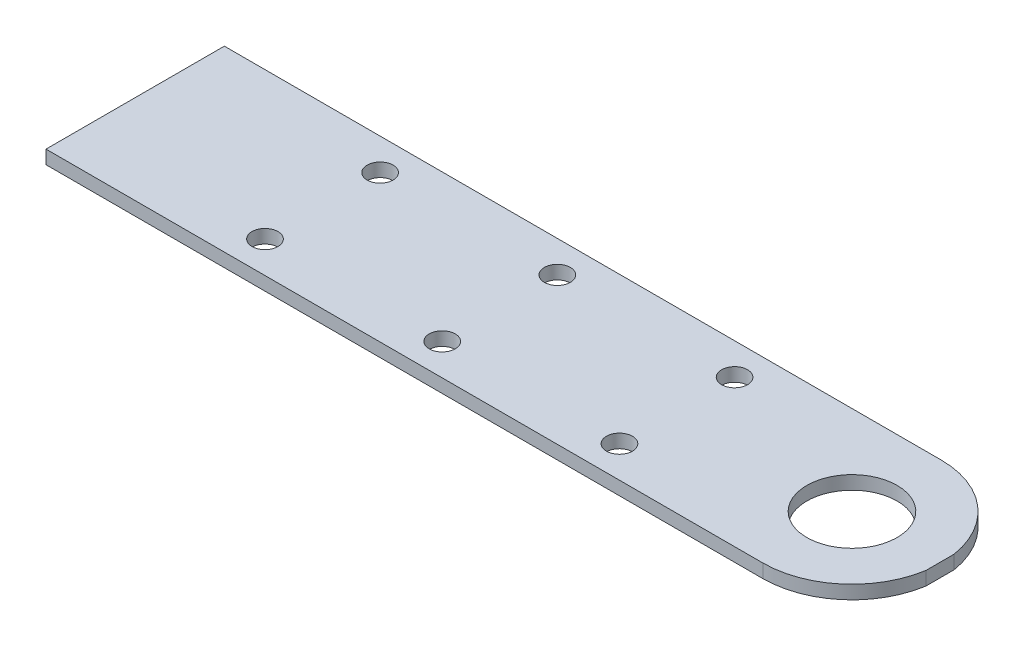
ISO-10303-21;
HEADER;
FILE_DESCRIPTION(('STEP AP214'),'2;1');
FILE_NAME('part.step','',(''),(''),'','','');
FILE_SCHEMA(('AUTOMOTIVE_DESIGN { 1 0 10303 214 1 1 1 1 }'));
ENDSEC;
DATA;
#1=APPLICATION_CONTEXT('core data for automotive mechanical design processes');
#2=APPLICATION_PROTOCOL_DEFINITION('international standard','automotive_design',2000,#1);
#3=PRODUCT_CONTEXT('',#1,'mechanical');
#4=PRODUCT('Part','Part','',(#3));
#5=PRODUCT_RELATED_PRODUCT_CATEGORY('part','',(#4));
#6=PRODUCT_DEFINITION_FORMATION('','',#4);
#7=PRODUCT_DEFINITION_CONTEXT('part definition',#1,'design');
#8=PRODUCT_DEFINITION('design','',#6,#7);
#9=PRODUCT_DEFINITION_SHAPE('','',#8);
#10=(LENGTH_UNIT() NAMED_UNIT(*) SI_UNIT(.MILLI.,.METRE.));
#11=(NAMED_UNIT(*) PLANE_ANGLE_UNIT() SI_UNIT($,.RADIAN.));
#12=(NAMED_UNIT(*) SI_UNIT($,.STERADIAN.) SOLID_ANGLE_UNIT());
#13=UNCERTAINTY_MEASURE_WITH_UNIT(LENGTH_MEASURE(1.E-05),#10,'distance_accuracy_value','');
#14=(GEOMETRIC_REPRESENTATION_CONTEXT(3) GLOBAL_UNCERTAINTY_ASSIGNED_CONTEXT((#13)) GLOBAL_UNIT_ASSIGNED_CONTEXT((#10,
#11,#12)) REPRESENTATION_CONTEXT('',''));
#15=CARTESIAN_POINT('',(0.,0.,0.));
#16=DIRECTION('',(0.,0.,1.));
#17=DIRECTION('',(1.,0.,0.));
#18=AXIS2_PLACEMENT_3D('',#15,#16,#17);
#19=CARTESIAN_POINT('',(0.,1.524,0.));
#20=DIRECTION('',(0.,0.,1.));
#21=DIRECTION('',(1.,0.,0.));
#22=AXIS2_PLACEMENT_3D('',#19,#20,#21);
#23=PLANE('',#22);
#24=DIRECTION('',(-1.,0.,0.));
#25=VECTOR('',#24,1.);
#26=CARTESIAN_POINT('',(0.,0.,0.));
#27=LINE('',#26,#25);
#28=CARTESIAN_POINT('',(-9.906,0.,0.));
#29=VERTEX_POINT('',#28);
#30=CARTESIAN_POINT('',(-90.551,0.,0.));
#31=VERTEX_POINT('',#30);
#32=EDGE_CURVE('E144',#29,#31,#27,.T.);
#33=ORIENTED_EDGE('',*,*,#32,.F.);
#34=DIRECTION('',(0.,-1.,0.));
#35=VECTOR('',#34,1.);
#36=CARTESIAN_POINT('',(-9.906,1.524,0.));
#37=LINE('',#36,#35);
#38=CARTESIAN_POINT('',(-9.906,1.524,0.));
#39=VERTEX_POINT('',#38);
#40=EDGE_CURVE('E11',#39,#29,#37,.T.);
#41=ORIENTED_EDGE('',*,*,#40,.F.);
#42=DIRECTION('',(-1.,0.,0.));
#43=VECTOR('',#42,1.);
#44=CARTESIAN_POINT('',(0.,1.524,0.));
#45=LINE('',#44,#43);
#46=CARTESIAN_POINT('',(-90.551,1.524,0.));
#47=VERTEX_POINT('',#46);
#48=EDGE_CURVE('E255',#39,#47,#45,.T.);
#49=ORIENTED_EDGE('',*,*,#48,.T.);
#50=DIRECTION('',(0.,-1.,0.));
#51=VECTOR('',#50,1.);
#52=CARTESIAN_POINT('',(-90.551,1.524,0.));
#53=LINE('',#52,#51);
#54=EDGE_CURVE('E59',#47,#31,#53,.T.);
#55=ORIENTED_EDGE('',*,*,#54,.T.);
#56=EDGE_LOOP('',(#33,#41,#49,#55));
#57=FACE_BOUND('',#56,.T.);
#58=ADVANCED_FACE('F41',(#57),#23,.T.);
#59=CARTESIAN_POINT('',(-9.906,1.524,-10.033));
#60=DIRECTION('',(0.,-1.,0.));
#61=DIRECTION('',(0.,0.,-1.));
#62=AXIS2_PLACEMENT_3D('',#59,#60,#61);
#63=CYLINDRICAL_SURFACE('',#62,10.033);
#64=CARTESIAN_POINT('',(-9.906,0.,-10.033));
#65=DIRECTION('',(0.,1.,0.));
#66=DIRECTION('',(0.,0.,1.));
#67=AXIS2_PLACEMENT_3D('',#64,#65,#66);
#68=CIRCLE('',#67,10.033);
#69=CARTESIAN_POINT('',(0.,0.,-8.44169456106001));
#70=VERTEX_POINT('',#69);
#71=EDGE_CURVE('E140',#29,#70,#68,.T.);
#72=ORIENTED_EDGE('',*,*,#71,.T.);
#73=DIRECTION('',(0.,-1.,0.));
#74=VECTOR('',#73,1.);
#75=CARTESIAN_POINT('',(0.,1.524,-8.44169456106001));
#76=LINE('',#75,#74);
#77=CARTESIAN_POINT('',(0.,1.524,-8.44169456106001));
#78=VERTEX_POINT('',#77);
#79=EDGE_CURVE('E51',#78,#70,#76,.T.);
#80=ORIENTED_EDGE('',*,*,#79,.F.);
#81=CARTESIAN_POINT('',(-9.906,1.524,-10.033));
#82=DIRECTION('',(0.,1.,0.));
#83=DIRECTION('',(0.,0.,1.));
#84=AXIS2_PLACEMENT_3D('',#81,#82,#83);
#85=CIRCLE('',#84,10.033);
#86=EDGE_CURVE('E119',#39,#78,#85,.T.);
#87=ORIENTED_EDGE('',*,*,#86,.F.);
#88=ORIENTED_EDGE('',*,*,#40,.T.);
#89=EDGE_LOOP('',(#72,#80,#87,#88));
#90=FACE_BOUND('',#89,.T.);
#91=ADVANCED_FACE('F141',(#90),#63,.T.);
#92=CARTESIAN_POINT('',(0.,1.524,0.));
#93=DIRECTION('',(-1.,0.,0.));
#94=DIRECTION('',(0.,0.,1.));
#95=AXIS2_PLACEMENT_3D('',#92,#93,#94);
#96=PLANE('',#95);
#97=DIRECTION('',(0.,0.,-1.));
#98=VECTOR('',#97,1.);
#99=CARTESIAN_POINT('',(0.,0.,0.));
#100=LINE('',#99,#98);
#101=CARTESIAN_POINT('',(0.,0.,-11.62430543894));
#102=VERTEX_POINT('',#101);
#103=EDGE_CURVE('E137',#70,#102,#100,.T.);
#104=ORIENTED_EDGE('',*,*,#103,.T.);
#105=DIRECTION('',(0.,-1.,0.));
#106=VECTOR('',#105,1.);
#107=CARTESIAN_POINT('',(0.,1.524,-11.62430543894));
#108=LINE('',#107,#106);
#109=CARTESIAN_POINT('',(0.,1.524,-11.62430543894));
#110=VERTEX_POINT('',#109);
#111=EDGE_CURVE('E123',#110,#102,#108,.T.);
#112=ORIENTED_EDGE('',*,*,#111,.F.);
#113=DIRECTION('',(0.,0.,-1.));
#114=VECTOR('',#113,1.);
#115=CARTESIAN_POINT('',(0.,1.524,0.));
#116=LINE('',#115,#114);
#117=EDGE_CURVE('E113',#78,#110,#116,.T.);
#118=ORIENTED_EDGE('',*,*,#117,.F.);
#119=ORIENTED_EDGE('',*,*,#79,.T.);
#120=EDGE_LOOP('',(#104,#112,#118,#119));
#121=FACE_BOUND('',#120,.T.);
#122=ADVANCED_FACE('F136',(#121),#96,.F.);
#123=CARTESIAN_POINT('',(-9.906,0.,-20.066));
#124=VERTEX_POINT('',#123);
#125=EDGE_CURVE('E121',#102,#124,#68,.T.);
#126=ORIENTED_EDGE('',*,*,#125,.T.);
#127=DIRECTION('',(0.,-1.,0.));
#128=VECTOR('',#127,1.);
#129=CARTESIAN_POINT('',(-9.906,1.524,-20.066));
#130=LINE('',#129,#128);
#131=CARTESIAN_POINT('',(-9.906,1.524,-20.066));
#132=VERTEX_POINT('',#131);
#133=EDGE_CURVE('E101',#132,#124,#130,.T.);
#134=ORIENTED_EDGE('',*,*,#133,.F.);
#135=EDGE_CURVE('E107',#110,#132,#85,.T.);
#136=ORIENTED_EDGE('',*,*,#135,.F.);
#137=ORIENTED_EDGE('',*,*,#111,.T.);
#138=EDGE_LOOP('',(#126,#134,#136,#137));
#139=FACE_BOUND('',#138,.T.);
#140=ADVANCED_FACE('F120',(#139),#63,.T.);
#141=CARTESIAN_POINT('',(0.,1.524,-20.066));
#142=DIRECTION('',(0.,0.,1.));
#143=DIRECTION('',(1.,0.,0.));
#144=AXIS2_PLACEMENT_3D('',#141,#142,#143);
#145=PLANE('',#144);
#146=DIRECTION('',(-1.,0.,0.));
#147=VECTOR('',#146,1.);
#148=CARTESIAN_POINT('',(0.,0.,-20.066));
#149=LINE('',#148,#147);
#150=CARTESIAN_POINT('',(-90.551,0.,-20.066));
#151=VERTEX_POINT('',#150);
#152=EDGE_CURVE('E152',#124,#151,#149,.T.);
#153=ORIENTED_EDGE('',*,*,#152,.T.);
#154=DIRECTION('',(0.,-1.,0.));
#155=VECTOR('',#154,1.);
#156=CARTESIAN_POINT('',(-90.551,1.524,-20.066));
#157=LINE('',#156,#155);
#158=CARTESIAN_POINT('',(-90.551,1.524,-20.066));
#159=VERTEX_POINT('',#158);
#160=EDGE_CURVE('E79',#159,#151,#157,.T.);
#161=ORIENTED_EDGE('',*,*,#160,.F.);
#162=DIRECTION('',(-1.,0.,0.));
#163=VECTOR('',#162,1.);
#164=CARTESIAN_POINT('',(0.,1.524,-20.066));
#165=LINE('',#164,#163);
#166=EDGE_CURVE('E97',#132,#159,#165,.T.);
#167=ORIENTED_EDGE('',*,*,#166,.F.);
#168=ORIENTED_EDGE('',*,*,#133,.T.);
#169=EDGE_LOOP('',(#153,#161,#167,#168));
#170=FACE_BOUND('',#169,.T.);
#171=ADVANCED_FACE('F99',(#170),#145,.F.);
#172=CARTESIAN_POINT('',(-69.469,1.524,-16.51));
#173=DIRECTION('',(0.,-1.,0.));
#174=DIRECTION('',(0.,0.,-1.));
#175=AXIS2_PLACEMENT_3D('',#172,#173,#174);
#176=CYLINDRICAL_SURFACE('',#175,1.4605);
#177=CARTESIAN_POINT('',(-69.469,1.524,-16.51));
#178=DIRECTION('',(0.,1.,0.));
#179=DIRECTION('',(0.,0.,1.));
#180=AXIS2_PLACEMENT_3D('',#177,#178,#179);
#181=CIRCLE('',#180,1.4605);
#182=CARTESIAN_POINT('',(-69.469,1.524,-17.9705));
#183=VERTEX_POINT('',#182);
#184=EDGE_CURVE('E253',#183,#183,#181,.T.);
#185=CARTESIAN_POINT('',(-69.469,0.,-16.51));
#186=DIRECTION('',(0.,1.,0.));
#187=DIRECTION('',(0.,0.,1.));
#188=AXIS2_PLACEMENT_3D('',#185,#186,#187);
#189=CIRCLE('',#188,1.4605);
#190=CARTESIAN_POINT('',(-69.469,0.,-17.9705));
#191=VERTEX_POINT('',#190);
#192=EDGE_CURVE('E149',#191,#191,#189,.T.);
#193=CARTESIAN_POINT('',(-69.469,1.524,-17.9705));
#194=CARTESIAN_POINT('',(-69.469,1.508125,-17.9705));
#195=CARTESIAN_POINT('',(-69.469,1.49225,-17.9705));
#196=CARTESIAN_POINT('',(-69.469,1.4605,-17.9705));
#197=CARTESIAN_POINT('',(-69.469,1.444625,-17.9705));
#198=CARTESIAN_POINT('',(-69.469,1.412875,-17.9705));
#199=CARTESIAN_POINT('',(-69.469,1.397,-17.9705));
#200=CARTESIAN_POINT('',(-69.469,1.36525,-17.9705));
#201=CARTESIAN_POINT('',(-69.469,1.349375,-17.9705));
#202=CARTESIAN_POINT('',(-69.469,1.317625,-17.9705));
#203=CARTESIAN_POINT('',(-69.469,1.30175,-17.9705));
#204=CARTESIAN_POINT('',(-69.469,1.27,-17.9705));
#205=CARTESIAN_POINT('',(-69.469,1.254125,-17.9705));
#206=CARTESIAN_POINT('',(-69.469,1.222375,-17.9705));
#207=CARTESIAN_POINT('',(-69.469,1.2065,-17.9705));
#208=CARTESIAN_POINT('',(-69.469,1.17475,-17.9705));
#209=CARTESIAN_POINT('',(-69.469,1.158875,-17.9705));
#210=CARTESIAN_POINT('',(-69.469,1.127125,-17.9705));
#211=CARTESIAN_POINT('',(-69.469,1.11125,-17.9705));
#212=CARTESIAN_POINT('',(-69.469,1.0795,-17.9705));
#213=CARTESIAN_POINT('',(-69.469,1.063625,-17.9705));
#214=CARTESIAN_POINT('',(-69.469,1.031875,-17.9705));
#215=CARTESIAN_POINT('',(-69.469,1.016,-17.9705));
#216=CARTESIAN_POINT('',(-69.469,0.98425,-17.9705));
#217=CARTESIAN_POINT('',(-69.469,0.968375,-17.9705));
#218=CARTESIAN_POINT('',(-69.469,0.936625,-17.9705));
#219=CARTESIAN_POINT('',(-69.469,0.92075,-17.9705));
#220=CARTESIAN_POINT('',(-69.469,0.889,-17.9705));
#221=CARTESIAN_POINT('',(-69.469,0.873125,-17.9705));
#222=CARTESIAN_POINT('',(-69.469,0.841375,-17.9705));
#223=CARTESIAN_POINT('',(-69.469,0.8255,-17.9705));
#224=CARTESIAN_POINT('',(-69.469,0.79375,-17.9705));
#225=CARTESIAN_POINT('',(-69.469,0.777875,-17.9705));
#226=CARTESIAN_POINT('',(-69.469,0.746125,-17.9705));
#227=CARTESIAN_POINT('',(-69.469,0.73025,-17.9705));
#228=CARTESIAN_POINT('',(-69.469,0.6985,-17.9705));
#229=CARTESIAN_POINT('',(-69.469,0.682625,-17.9705));
#230=CARTESIAN_POINT('',(-69.469,0.650875,-17.9705));
#231=CARTESIAN_POINT('',(-69.469,0.635,-17.9705));
#232=CARTESIAN_POINT('',(-69.469,0.60325,-17.9705));
#233=CARTESIAN_POINT('',(-69.469,0.587375,-17.9705));
#234=CARTESIAN_POINT('',(-69.469,0.555625,-17.9705));
#235=CARTESIAN_POINT('',(-69.469,0.53975,-17.9705));
#236=CARTESIAN_POINT('',(-69.469,0.508,-17.9705));
#237=CARTESIAN_POINT('',(-69.469,0.492125,-17.9705));
#238=CARTESIAN_POINT('',(-69.469,0.460375,-17.9705));
#239=CARTESIAN_POINT('',(-69.469,0.4445,-17.9705));
#240=CARTESIAN_POINT('',(-69.469,0.41275,-17.9705));
#241=CARTESIAN_POINT('',(-69.469,0.396875,-17.9705));
#242=CARTESIAN_POINT('',(-69.469,0.365125,-17.9705));
#243=CARTESIAN_POINT('',(-69.469,0.34925,-17.9705));
#244=CARTESIAN_POINT('',(-69.469,0.3175,-17.9705));
#245=CARTESIAN_POINT('',(-69.469,0.301625,-17.9705));
#246=CARTESIAN_POINT('',(-69.469,0.269875,-17.9705));
#247=CARTESIAN_POINT('',(-69.469,0.254,-17.9705));
#248=CARTESIAN_POINT('',(-69.469,0.22225,-17.9705));
#249=CARTESIAN_POINT('',(-69.469,0.206375,-17.9705));
#250=CARTESIAN_POINT('',(-69.469,0.174625,-17.9705));
#251=CARTESIAN_POINT('',(-69.469,0.15875,-17.9705));
#252=CARTESIAN_POINT('',(-69.469,0.127,-17.9705));
#253=CARTESIAN_POINT('',(-69.469,0.111125,-17.9705));
#254=CARTESIAN_POINT('',(-69.469,0.079375,-17.9705));
#255=CARTESIAN_POINT('',(-69.469,0.0635,-17.9705));
#256=CARTESIAN_POINT('',(-69.469,0.0317499999999999,-17.9705));
#257=CARTESIAN_POINT('',(-69.469,0.015875,-17.9705));
#258=CARTESIAN_POINT('',(-69.469,0.,-17.9705));
#259=B_SPLINE_CURVE_WITH_KNOTS('',3,(#193,#194,#195,#196,#197,#198,#199,#200,#201,#202,#203,
#204,#205,#206,#207,#208,#209,#210,#211,#212,#213,#214,#215,#216,#217,#218,#219,#220,#221,#222,
#223,#224,#225,#226,#227,#228,#229,#230,#231,#232,#233,#234,#235,#236,#237,#238,#239,#240,#241,
#242,#243,#244,#245,#246,#247,#248,#249,#250,#251,#252,#253,#254,#255,#256,#257,#258),
.UNSPECIFIED.,.F.,.F.,(4,2,2,2,2,2,2,2,2,2,2,2,2,2,2,2,2,2,2,2,2,2,2,2,2,2,2,2,2,2,2,2,4),(0.,
0.0476250000000001,0.0952500000000001,0.142875,0.1905,0.238125,0.28575,0.333375,0.381,0.428625,
0.47625,0.523875,0.5715,0.619125,0.66675,0.714375,0.762,0.809625,0.85725,0.904875,0.9525,
1.000125,1.04775,1.095375,1.143,1.190625,1.23825,1.285875,1.3335,1.381125,1.42875,1.476375,
1.524),.UNSPECIFIED.);
#260=EDGE_CURVE('BSEAM195',#183,#191,#259,.T.);
#261=ORIENTED_EDGE('',*,*,#184,.T.);
#262=ORIENTED_EDGE('',*,*,#192,.F.);
#263=ORIENTED_EDGE('',*,*,#260,.T.);
#264=ORIENTED_EDGE('',*,*,#260,.F.);
#265=EDGE_LOOP('',(#261,#263,#262,#264));
#266=FACE_BOUND('',#265,.T.);
#267=ADVANCED_FACE('F195',(#266),#176,.F.);
#268=CARTESIAN_POINT('',(-69.469,1.524,-3.556));
#269=DIRECTION('',(0.,-1.,0.));
#270=DIRECTION('',(0.,0.,-1.));
#271=AXIS2_PLACEMENT_3D('',#268,#269,#270);
#272=CYLINDRICAL_SURFACE('',#271,1.4605);
#273=CARTESIAN_POINT('',(-69.469,1.524,-3.556));
#274=DIRECTION('',(0.,1.,0.));
#275=DIRECTION('',(0.,0.,1.));
#276=AXIS2_PLACEMENT_3D('',#273,#274,#275);
#277=CIRCLE('',#276,1.4605);
#278=CARTESIAN_POINT('',(-69.469,1.524,-5.0165));
#279=VERTEX_POINT('',#278);
#280=EDGE_CURVE('E251',#279,#279,#277,.T.);
#281=CARTESIAN_POINT('',(-69.469,0.,-3.556));
#282=DIRECTION('',(0.,1.,0.));
#283=DIRECTION('',(0.,0.,1.));
#284=AXIS2_PLACEMENT_3D('',#281,#282,#283);
#285=CIRCLE('',#284,1.4605);
#286=CARTESIAN_POINT('',(-69.469,0.,-5.0165));
#287=VERTEX_POINT('',#286);
#288=EDGE_CURVE('E185',#287,#287,#285,.T.);
#289=CARTESIAN_POINT('',(-69.469,1.524,-5.0165));
#290=CARTESIAN_POINT('',(-69.469,1.508125,-5.0165));
#291=CARTESIAN_POINT('',(-69.469,1.49225,-5.0165));
#292=CARTESIAN_POINT('',(-69.469,1.4605,-5.0165));
#293=CARTESIAN_POINT('',(-69.469,1.444625,-5.0165));
#294=CARTESIAN_POINT('',(-69.469,1.412875,-5.0165));
#295=CARTESIAN_POINT('',(-69.469,1.397,-5.0165));
#296=CARTESIAN_POINT('',(-69.469,1.36525,-5.0165));
#297=CARTESIAN_POINT('',(-69.469,1.349375,-5.0165));
#298=CARTESIAN_POINT('',(-69.469,1.317625,-5.0165));
#299=CARTESIAN_POINT('',(-69.469,1.30175,-5.0165));
#300=CARTESIAN_POINT('',(-69.469,1.27,-5.0165));
#301=CARTESIAN_POINT('',(-69.469,1.254125,-5.0165));
#302=CARTESIAN_POINT('',(-69.469,1.222375,-5.0165));
#303=CARTESIAN_POINT('',(-69.469,1.2065,-5.0165));
#304=CARTESIAN_POINT('',(-69.469,1.17475,-5.0165));
#305=CARTESIAN_POINT('',(-69.469,1.158875,-5.0165));
#306=CARTESIAN_POINT('',(-69.469,1.127125,-5.0165));
#307=CARTESIAN_POINT('',(-69.469,1.11125,-5.0165));
#308=CARTESIAN_POINT('',(-69.469,1.0795,-5.0165));
#309=CARTESIAN_POINT('',(-69.469,1.063625,-5.0165));
#310=CARTESIAN_POINT('',(-69.469,1.031875,-5.0165));
#311=CARTESIAN_POINT('',(-69.469,1.016,-5.0165));
#312=CARTESIAN_POINT('',(-69.469,0.98425,-5.0165));
#313=CARTESIAN_POINT('',(-69.469,0.968375,-5.0165));
#314=CARTESIAN_POINT('',(-69.469,0.936625,-5.0165));
#315=CARTESIAN_POINT('',(-69.469,0.92075,-5.0165));
#316=CARTESIAN_POINT('',(-69.469,0.889,-5.0165));
#317=CARTESIAN_POINT('',(-69.469,0.873125,-5.0165));
#318=CARTESIAN_POINT('',(-69.469,0.841375,-5.0165));
#319=CARTESIAN_POINT('',(-69.469,0.8255,-5.0165));
#320=CARTESIAN_POINT('',(-69.469,0.79375,-5.0165));
#321=CARTESIAN_POINT('',(-69.469,0.777875,-5.0165));
#322=CARTESIAN_POINT('',(-69.469,0.746125,-5.0165));
#323=CARTESIAN_POINT('',(-69.469,0.73025,-5.0165));
#324=CARTESIAN_POINT('',(-69.469,0.6985,-5.0165));
#325=CARTESIAN_POINT('',(-69.469,0.682625,-5.0165));
#326=CARTESIAN_POINT('',(-69.469,0.650875,-5.0165));
#327=CARTESIAN_POINT('',(-69.469,0.635,-5.0165));
#328=CARTESIAN_POINT('',(-69.469,0.60325,-5.0165));
#329=CARTESIAN_POINT('',(-69.469,0.587375,-5.0165));
#330=CARTESIAN_POINT('',(-69.469,0.555625,-5.0165));
#331=CARTESIAN_POINT('',(-69.469,0.53975,-5.0165));
#332=CARTESIAN_POINT('',(-69.469,0.508,-5.0165));
#333=CARTESIAN_POINT('',(-69.469,0.492125,-5.0165));
#334=CARTESIAN_POINT('',(-69.469,0.460375,-5.0165));
#335=CARTESIAN_POINT('',(-69.469,0.4445,-5.0165));
#336=CARTESIAN_POINT('',(-69.469,0.41275,-5.0165));
#337=CARTESIAN_POINT('',(-69.469,0.396875,-5.0165));
#338=CARTESIAN_POINT('',(-69.469,0.365125,-5.0165));
#339=CARTESIAN_POINT('',(-69.469,0.34925,-5.0165));
#340=CARTESIAN_POINT('',(-69.469,0.3175,-5.0165));
#341=CARTESIAN_POINT('',(-69.469,0.301625,-5.0165));
#342=CARTESIAN_POINT('',(-69.469,0.269875,-5.0165));
#343=CARTESIAN_POINT('',(-69.469,0.254,-5.0165));
#344=CARTESIAN_POINT('',(-69.469,0.22225,-5.0165));
#345=CARTESIAN_POINT('',(-69.469,0.206375,-5.0165));
#346=CARTESIAN_POINT('',(-69.469,0.174625,-5.0165));
#347=CARTESIAN_POINT('',(-69.469,0.15875,-5.0165));
#348=CARTESIAN_POINT('',(-69.469,0.127,-5.0165));
#349=CARTESIAN_POINT('',(-69.469,0.111125,-5.0165));
#350=CARTESIAN_POINT('',(-69.469,0.079375,-5.0165));
#351=CARTESIAN_POINT('',(-69.469,0.0635,-5.0165));
#352=CARTESIAN_POINT('',(-69.469,0.0317499999999999,-5.0165));
#353=CARTESIAN_POINT('',(-69.469,0.015875,-5.0165));
#354=CARTESIAN_POINT('',(-69.469,0.,-5.0165));
#355=B_SPLINE_CURVE_WITH_KNOTS('',3,(#289,#290,#291,#292,#293,#294,#295,#296,#297,#298,#299,
#300,#301,#302,#303,#304,#305,#306,#307,#308,#309,#310,#311,#312,#313,#314,#315,#316,#317,#318,
#319,#320,#321,#322,#323,#324,#325,#326,#327,#328,#329,#330,#331,#332,#333,#334,#335,#336,#337,
#338,#339,#340,#341,#342,#343,#344,#345,#346,#347,#348,#349,#350,#351,#352,#353,#354),
.UNSPECIFIED.,.F.,.F.,(4,2,2,2,2,2,2,2,2,2,2,2,2,2,2,2,2,2,2,2,2,2,2,2,2,2,2,2,2,2,2,2,4),(0.,
0.0476250000000001,0.0952500000000001,0.142875,0.1905,0.238125,0.28575,0.333375,0.381,0.428625,
0.47625,0.523875,0.5715,0.619125,0.66675,0.714375,0.762,0.809625,0.85725,0.904875,0.9525,
1.000125,1.04775,1.095375,1.143,1.190625,1.23825,1.285875,1.3335,1.381125,1.42875,1.476375,
1.524),.UNSPECIFIED.);
#356=EDGE_CURVE('BSEAM197',#279,#287,#355,.T.);
#357=ORIENTED_EDGE('',*,*,#280,.T.);
#358=ORIENTED_EDGE('',*,*,#288,.F.);
#359=ORIENTED_EDGE('',*,*,#356,.T.);
#360=ORIENTED_EDGE('',*,*,#356,.F.);
#361=EDGE_LOOP('',(#357,#359,#358,#360));
#362=FACE_BOUND('',#361,.T.);
#363=ADVANCED_FACE('F197',(#362),#272,.F.);
#364=CARTESIAN_POINT('',(-49.53,1.524,-16.51));
#365=DIRECTION('',(0.,-1.,0.));
#366=DIRECTION('',(0.,0.,-1.));
#367=AXIS2_PLACEMENT_3D('',#364,#365,#366);
#368=CYLINDRICAL_SURFACE('',#367,1.46050000000001);
#369=CARTESIAN_POINT('',(-49.53,1.524,-16.51));
#370=DIRECTION('',(0.,1.,0.));
#371=DIRECTION('',(0.,0.,1.));
#372=AXIS2_PLACEMENT_3D('',#369,#370,#371);
#373=CIRCLE('',#372,1.46050000000001);
#374=CARTESIAN_POINT('',(-49.53,1.524,-17.9705));
#375=VERTEX_POINT('',#374);
#376=EDGE_CURVE('E247',#375,#375,#373,.T.);
#377=CARTESIAN_POINT('',(-49.53,0.,-16.51));
#378=DIRECTION('',(0.,1.,0.));
#379=DIRECTION('',(0.,0.,1.));
#380=AXIS2_PLACEMENT_3D('',#377,#378,#379);
#381=CIRCLE('',#380,1.46050000000001);
#382=CARTESIAN_POINT('',(-49.53,0.,-17.9705));
#383=VERTEX_POINT('',#382);
#384=EDGE_CURVE('E181',#383,#383,#381,.T.);
#385=CARTESIAN_POINT('',(-49.53,1.524,-17.9705));
#386=CARTESIAN_POINT('',(-49.53,1.508125,-17.9705));
#387=CARTESIAN_POINT('',(-49.53,1.49225,-17.9705));
#388=CARTESIAN_POINT('',(-49.53,1.4605,-17.9705));
#389=CARTESIAN_POINT('',(-49.53,1.444625,-17.9705));
#390=CARTESIAN_POINT('',(-49.53,1.412875,-17.9705));
#391=CARTESIAN_POINT('',(-49.53,1.397,-17.9705));
#392=CARTESIAN_POINT('',(-49.53,1.36525,-17.9705));
#393=CARTESIAN_POINT('',(-49.53,1.349375,-17.9705));
#394=CARTESIAN_POINT('',(-49.53,1.317625,-17.9705));
#395=CARTESIAN_POINT('',(-49.53,1.30175,-17.9705));
#396=CARTESIAN_POINT('',(-49.53,1.27,-17.9705));
#397=CARTESIAN_POINT('',(-49.53,1.254125,-17.9705));
#398=CARTESIAN_POINT('',(-49.53,1.222375,-17.9705));
#399=CARTESIAN_POINT('',(-49.53,1.2065,-17.9705));
#400=CARTESIAN_POINT('',(-49.53,1.17475,-17.9705));
#401=CARTESIAN_POINT('',(-49.53,1.158875,-17.9705));
#402=CARTESIAN_POINT('',(-49.53,1.127125,-17.9705));
#403=CARTESIAN_POINT('',(-49.53,1.11125,-17.9705));
#404=CARTESIAN_POINT('',(-49.53,1.0795,-17.9705));
#405=CARTESIAN_POINT('',(-49.53,1.063625,-17.9705));
#406=CARTESIAN_POINT('',(-49.53,1.031875,-17.9705));
#407=CARTESIAN_POINT('',(-49.53,1.016,-17.9705));
#408=CARTESIAN_POINT('',(-49.53,0.98425,-17.9705));
#409=CARTESIAN_POINT('',(-49.53,0.968375,-17.9705));
#410=CARTESIAN_POINT('',(-49.53,0.936625,-17.9705));
#411=CARTESIAN_POINT('',(-49.53,0.92075,-17.9705));
#412=CARTESIAN_POINT('',(-49.53,0.889,-17.9705));
#413=CARTESIAN_POINT('',(-49.53,0.873125,-17.9705));
#414=CARTESIAN_POINT('',(-49.53,0.841375,-17.9705));
#415=CARTESIAN_POINT('',(-49.53,0.8255,-17.9705));
#416=CARTESIAN_POINT('',(-49.53,0.79375,-17.9705));
#417=CARTESIAN_POINT('',(-49.53,0.777875,-17.9705));
#418=CARTESIAN_POINT('',(-49.53,0.746125,-17.9705));
#419=CARTESIAN_POINT('',(-49.53,0.73025,-17.9705));
#420=CARTESIAN_POINT('',(-49.53,0.6985,-17.9705));
#421=CARTESIAN_POINT('',(-49.53,0.682625,-17.9705));
#422=CARTESIAN_POINT('',(-49.53,0.650875,-17.9705));
#423=CARTESIAN_POINT('',(-49.53,0.635,-17.9705));
#424=CARTESIAN_POINT('',(-49.53,0.60325,-17.9705));
#425=CARTESIAN_POINT('',(-49.53,0.587375,-17.9705));
#426=CARTESIAN_POINT('',(-49.53,0.555625,-17.9705));
#427=CARTESIAN_POINT('',(-49.53,0.53975,-17.9705));
#428=CARTESIAN_POINT('',(-49.53,0.508,-17.9705));
#429=CARTESIAN_POINT('',(-49.53,0.492125,-17.9705));
#430=CARTESIAN_POINT('',(-49.53,0.460375,-17.9705));
#431=CARTESIAN_POINT('',(-49.53,0.4445,-17.9705));
#432=CARTESIAN_POINT('',(-49.53,0.41275,-17.9705));
#433=CARTESIAN_POINT('',(-49.53,0.396875,-17.9705));
#434=CARTESIAN_POINT('',(-49.53,0.365125,-17.9705));
#435=CARTESIAN_POINT('',(-49.53,0.34925,-17.9705));
#436=CARTESIAN_POINT('',(-49.53,0.3175,-17.9705));
#437=CARTESIAN_POINT('',(-49.53,0.301625,-17.9705));
#438=CARTESIAN_POINT('',(-49.53,0.269875,-17.9705));
#439=CARTESIAN_POINT('',(-49.53,0.254,-17.9705));
#440=CARTESIAN_POINT('',(-49.53,0.22225,-17.9705));
#441=CARTESIAN_POINT('',(-49.53,0.206375,-17.9705));
#442=CARTESIAN_POINT('',(-49.53,0.174625,-17.9705));
#443=CARTESIAN_POINT('',(-49.53,0.15875,-17.9705));
#444=CARTESIAN_POINT('',(-49.53,0.127,-17.9705));
#445=CARTESIAN_POINT('',(-49.53,0.111125,-17.9705));
#446=CARTESIAN_POINT('',(-49.53,0.079375,-17.9705));
#447=CARTESIAN_POINT('',(-49.53,0.0635,-17.9705));
#448=CARTESIAN_POINT('',(-49.53,0.0317499999999999,-17.9705));
#449=CARTESIAN_POINT('',(-49.53,0.015875,-17.9705));
#450=CARTESIAN_POINT('',(-49.53,0.,-17.9705));
#451=B_SPLINE_CURVE_WITH_KNOTS('',3,(#385,#386,#387,#388,#389,#390,#391,#392,#393,#394,#395,
#396,#397,#398,#399,#400,#401,#402,#403,#404,#405,#406,#407,#408,#409,#410,#411,#412,#413,#414,
#415,#416,#417,#418,#419,#420,#421,#422,#423,#424,#425,#426,#427,#428,#429,#430,#431,#432,#433,
#434,#435,#436,#437,#438,#439,#440,#441,#442,#443,#444,#445,#446,#447,#448,#449,#450),
.UNSPECIFIED.,.F.,.F.,(4,2,2,2,2,2,2,2,2,2,2,2,2,2,2,2,2,2,2,2,2,2,2,2,2,2,2,2,2,2,2,2,4),(0.,
0.0476250000000001,0.0952500000000001,0.142875,0.1905,0.238125,0.28575,0.333375,0.381,0.428625,
0.47625,0.523875,0.5715,0.619125,0.66675,0.714375,0.762,0.809625,0.85725,0.904875,0.9525,
1.000125,1.04775,1.095375,1.143,1.190625,1.23825,1.285875,1.3335,1.381125,1.42875,1.476375,
1.524),.UNSPECIFIED.);
#452=EDGE_CURVE('BSEAM204',#375,#383,#451,.T.);
#453=ORIENTED_EDGE('',*,*,#376,.T.);
#454=ORIENTED_EDGE('',*,*,#384,.F.);
#455=ORIENTED_EDGE('',*,*,#452,.T.);
#456=ORIENTED_EDGE('',*,*,#452,.F.);
#457=EDGE_LOOP('',(#453,#455,#454,#456));
#458=FACE_BOUND('',#457,.T.);
#459=ADVANCED_FACE('F204',(#458),#368,.F.);
#460=CARTESIAN_POINT('',(-49.53,1.524,-3.556));
#461=DIRECTION('',(0.,-1.,0.));
#462=DIRECTION('',(0.,0.,-1.));
#463=AXIS2_PLACEMENT_3D('',#460,#461,#462);
#464=CYLINDRICAL_SURFACE('',#463,1.46050000000001);
#465=CARTESIAN_POINT('',(-49.53,1.524,-3.556));
#466=DIRECTION('',(0.,1.,0.));
#467=DIRECTION('',(0.,0.,1.));
#468=AXIS2_PLACEMENT_3D('',#465,#466,#467);
#469=CIRCLE('',#468,1.46050000000001);
#470=CARTESIAN_POINT('',(-49.53,1.524,-5.0165));
#471=VERTEX_POINT('',#470);
#472=EDGE_CURVE('E243',#471,#471,#469,.T.);
#473=CARTESIAN_POINT('',(-49.53,0.,-3.556));
#474=DIRECTION('',(0.,1.,0.));
#475=DIRECTION('',(0.,0.,1.));
#476=AXIS2_PLACEMENT_3D('',#473,#474,#475);
#477=CIRCLE('',#476,1.46050000000001);
#478=CARTESIAN_POINT('',(-49.53,0.,-5.0165));
#479=VERTEX_POINT('',#478);
#480=EDGE_CURVE('E177',#479,#479,#477,.T.);
#481=CARTESIAN_POINT('',(-49.53,1.524,-5.0165));
#482=CARTESIAN_POINT('',(-49.53,1.508125,-5.0165));
#483=CARTESIAN_POINT('',(-49.53,1.49225,-5.0165));
#484=CARTESIAN_POINT('',(-49.53,1.4605,-5.0165));
#485=CARTESIAN_POINT('',(-49.53,1.444625,-5.0165));
#486=CARTESIAN_POINT('',(-49.53,1.412875,-5.0165));
#487=CARTESIAN_POINT('',(-49.53,1.397,-5.0165));
#488=CARTESIAN_POINT('',(-49.53,1.36525,-5.0165));
#489=CARTESIAN_POINT('',(-49.53,1.349375,-5.0165));
#490=CARTESIAN_POINT('',(-49.53,1.317625,-5.0165));
#491=CARTESIAN_POINT('',(-49.53,1.30175,-5.0165));
#492=CARTESIAN_POINT('',(-49.53,1.27,-5.0165));
#493=CARTESIAN_POINT('',(-49.53,1.254125,-5.0165));
#494=CARTESIAN_POINT('',(-49.53,1.222375,-5.0165));
#495=CARTESIAN_POINT('',(-49.53,1.2065,-5.0165));
#496=CARTESIAN_POINT('',(-49.53,1.17475,-5.0165));
#497=CARTESIAN_POINT('',(-49.53,1.158875,-5.0165));
#498=CARTESIAN_POINT('',(-49.53,1.127125,-5.0165));
#499=CARTESIAN_POINT('',(-49.53,1.11125,-5.0165));
#500=CARTESIAN_POINT('',(-49.53,1.0795,-5.0165));
#501=CARTESIAN_POINT('',(-49.53,1.063625,-5.0165));
#502=CARTESIAN_POINT('',(-49.53,1.031875,-5.0165));
#503=CARTESIAN_POINT('',(-49.53,1.016,-5.0165));
#504=CARTESIAN_POINT('',(-49.53,0.98425,-5.0165));
#505=CARTESIAN_POINT('',(-49.53,0.968375,-5.0165));
#506=CARTESIAN_POINT('',(-49.53,0.936625,-5.0165));
#507=CARTESIAN_POINT('',(-49.53,0.92075,-5.0165));
#508=CARTESIAN_POINT('',(-49.53,0.889,-5.0165));
#509=CARTESIAN_POINT('',(-49.53,0.873125,-5.0165));
#510=CARTESIAN_POINT('',(-49.53,0.841375,-5.0165));
#511=CARTESIAN_POINT('',(-49.53,0.8255,-5.0165));
#512=CARTESIAN_POINT('',(-49.53,0.79375,-5.0165));
#513=CARTESIAN_POINT('',(-49.53,0.777875,-5.0165));
#514=CARTESIAN_POINT('',(-49.53,0.746125,-5.0165));
#515=CARTESIAN_POINT('',(-49.53,0.73025,-5.0165));
#516=CARTESIAN_POINT('',(-49.53,0.6985,-5.0165));
#517=CARTESIAN_POINT('',(-49.53,0.682625,-5.0165));
#518=CARTESIAN_POINT('',(-49.53,0.650875,-5.0165));
#519=CARTESIAN_POINT('',(-49.53,0.635,-5.0165));
#520=CARTESIAN_POINT('',(-49.53,0.60325,-5.0165));
#521=CARTESIAN_POINT('',(-49.53,0.587375,-5.0165));
#522=CARTESIAN_POINT('',(-49.53,0.555625,-5.0165));
#523=CARTESIAN_POINT('',(-49.53,0.53975,-5.0165));
#524=CARTESIAN_POINT('',(-49.53,0.508,-5.0165));
#525=CARTESIAN_POINT('',(-49.53,0.492125,-5.0165));
#526=CARTESIAN_POINT('',(-49.53,0.460375,-5.0165));
#527=CARTESIAN_POINT('',(-49.53,0.4445,-5.0165));
#528=CARTESIAN_POINT('',(-49.53,0.41275,-5.0165));
#529=CARTESIAN_POINT('',(-49.53,0.396875,-5.0165));
#530=CARTESIAN_POINT('',(-49.53,0.365125,-5.0165));
#531=CARTESIAN_POINT('',(-49.53,0.34925,-5.0165));
#532=CARTESIAN_POINT('',(-49.53,0.3175,-5.0165));
#533=CARTESIAN_POINT('',(-49.53,0.301625,-5.0165));
#534=CARTESIAN_POINT('',(-49.53,0.269875,-5.0165));
#535=CARTESIAN_POINT('',(-49.53,0.254,-5.0165));
#536=CARTESIAN_POINT('',(-49.53,0.22225,-5.0165));
#537=CARTESIAN_POINT('',(-49.53,0.206375,-5.0165));
#538=CARTESIAN_POINT('',(-49.53,0.174625,-5.0165));
#539=CARTESIAN_POINT('',(-49.53,0.15875,-5.0165));
#540=CARTESIAN_POINT('',(-49.53,0.127,-5.0165));
#541=CARTESIAN_POINT('',(-49.53,0.111125,-5.0165));
#542=CARTESIAN_POINT('',(-49.53,0.079375,-5.0165));
#543=CARTESIAN_POINT('',(-49.53,0.0635,-5.0165));
#544=CARTESIAN_POINT('',(-49.53,0.0317499999999999,-5.0165));
#545=CARTESIAN_POINT('',(-49.53,0.015875,-5.0165));
#546=CARTESIAN_POINT('',(-49.53,0.,-5.0165));
#547=B_SPLINE_CURVE_WITH_KNOTS('',3,(#481,#482,#483,#484,#485,#486,#487,#488,#489,#490,#491,
#492,#493,#494,#495,#496,#497,#498,#499,#500,#501,#502,#503,#504,#505,#506,#507,#508,#509,#510,
#511,#512,#513,#514,#515,#516,#517,#518,#519,#520,#521,#522,#523,#524,#525,#526,#527,#528,#529,
#530,#531,#532,#533,#534,#535,#536,#537,#538,#539,#540,#541,#542,#543,#544,#545,#546),
.UNSPECIFIED.,.F.,.F.,(4,2,2,2,2,2,2,2,2,2,2,2,2,2,2,2,2,2,2,2,2,2,2,2,2,2,2,2,2,2,2,2,4),(0.,
0.0476250000000001,0.0952500000000001,0.142875,0.1905,0.238125,0.28575,0.333375,0.381,0.428625,
0.47625,0.523875,0.5715,0.619125,0.66675,0.714375,0.762,0.809625,0.85725,0.904875,0.9525,
1.000125,1.04775,1.095375,1.143,1.190625,1.23825,1.285875,1.3335,1.381125,1.42875,1.476375,
1.524),.UNSPECIFIED.);
#548=EDGE_CURVE('BSEAM291',#471,#479,#547,.T.);
#549=ORIENTED_EDGE('',*,*,#472,.T.);
#550=ORIENTED_EDGE('',*,*,#480,.F.);
#551=ORIENTED_EDGE('',*,*,#548,.T.);
#552=ORIENTED_EDGE('',*,*,#548,.F.);
#553=EDGE_LOOP('',(#549,#551,#550,#552));
#554=FACE_BOUND('',#553,.T.);
#555=ADVANCED_FACE('F291',(#554),#464,.F.);
#556=CARTESIAN_POINT('',(-29.591,1.524,-16.51));
#557=DIRECTION('',(0.,-1.,0.));
#558=DIRECTION('',(0.,0.,-1.));
#559=AXIS2_PLACEMENT_3D('',#556,#557,#558);
#560=CYLINDRICAL_SURFACE('',#559,1.4605);
#561=CARTESIAN_POINT('',(-29.591,1.524,-16.51));
#562=DIRECTION('',(0.,1.,0.));
#563=DIRECTION('',(0.,0.,1.));
#564=AXIS2_PLACEMENT_3D('',#561,#562,#563);
#565=CIRCLE('',#564,1.4605);
#566=CARTESIAN_POINT('',(-29.591,1.524,-17.9705));
#567=VERTEX_POINT('',#566);
#568=EDGE_CURVE('E239',#567,#567,#565,.T.);
#569=CARTESIAN_POINT('',(-29.591,0.,-16.51));
#570=DIRECTION('',(0.,1.,0.));
#571=DIRECTION('',(0.,0.,1.));
#572=AXIS2_PLACEMENT_3D('',#569,#570,#571);
#573=CIRCLE('',#572,1.4605);
#574=CARTESIAN_POINT('',(-29.591,0.,-17.9705));
#575=VERTEX_POINT('',#574);
#576=EDGE_CURVE('E173',#575,#575,#573,.T.);
#577=CARTESIAN_POINT('',(-29.591,1.524,-17.9705));
#578=CARTESIAN_POINT('',(-29.591,1.508125,-17.9705));
#579=CARTESIAN_POINT('',(-29.591,1.49225,-17.9705));
#580=CARTESIAN_POINT('',(-29.591,1.4605,-17.9705));
#581=CARTESIAN_POINT('',(-29.591,1.444625,-17.9705));
#582=CARTESIAN_POINT('',(-29.591,1.412875,-17.9705));
#583=CARTESIAN_POINT('',(-29.591,1.397,-17.9705));
#584=CARTESIAN_POINT('',(-29.591,1.36525,-17.9705));
#585=CARTESIAN_POINT('',(-29.591,1.349375,-17.9705));
#586=CARTESIAN_POINT('',(-29.591,1.317625,-17.9705));
#587=CARTESIAN_POINT('',(-29.591,1.30175,-17.9705));
#588=CARTESIAN_POINT('',(-29.591,1.27,-17.9705));
#589=CARTESIAN_POINT('',(-29.591,1.254125,-17.9705));
#590=CARTESIAN_POINT('',(-29.591,1.222375,-17.9705));
#591=CARTESIAN_POINT('',(-29.591,1.2065,-17.9705));
#592=CARTESIAN_POINT('',(-29.591,1.17475,-17.9705));
#593=CARTESIAN_POINT('',(-29.591,1.158875,-17.9705));
#594=CARTESIAN_POINT('',(-29.591,1.127125,-17.9705));
#595=CARTESIAN_POINT('',(-29.591,1.11125,-17.9705));
#596=CARTESIAN_POINT('',(-29.591,1.0795,-17.9705));
#597=CARTESIAN_POINT('',(-29.591,1.063625,-17.9705));
#598=CARTESIAN_POINT('',(-29.591,1.031875,-17.9705));
#599=CARTESIAN_POINT('',(-29.591,1.016,-17.9705));
#600=CARTESIAN_POINT('',(-29.591,0.98425,-17.9705));
#601=CARTESIAN_POINT('',(-29.591,0.968375,-17.9705));
#602=CARTESIAN_POINT('',(-29.591,0.936625,-17.9705));
#603=CARTESIAN_POINT('',(-29.591,0.92075,-17.9705));
#604=CARTESIAN_POINT('',(-29.591,0.889,-17.9705));
#605=CARTESIAN_POINT('',(-29.591,0.873125,-17.9705));
#606=CARTESIAN_POINT('',(-29.591,0.841375,-17.9705));
#607=CARTESIAN_POINT('',(-29.591,0.8255,-17.9705));
#608=CARTESIAN_POINT('',(-29.591,0.79375,-17.9705));
#609=CARTESIAN_POINT('',(-29.591,0.777875,-17.9705));
#610=CARTESIAN_POINT('',(-29.591,0.746125,-17.9705));
#611=CARTESIAN_POINT('',(-29.591,0.73025,-17.9705));
#612=CARTESIAN_POINT('',(-29.591,0.6985,-17.9705));
#613=CARTESIAN_POINT('',(-29.591,0.682625,-17.9705));
#614=CARTESIAN_POINT('',(-29.591,0.650875,-17.9705));
#615=CARTESIAN_POINT('',(-29.591,0.635,-17.9705));
#616=CARTESIAN_POINT('',(-29.591,0.60325,-17.9705));
#617=CARTESIAN_POINT('',(-29.591,0.587375,-17.9705));
#618=CARTESIAN_POINT('',(-29.591,0.555625,-17.9705));
#619=CARTESIAN_POINT('',(-29.591,0.53975,-17.9705));
#620=CARTESIAN_POINT('',(-29.591,0.508,-17.9705));
#621=CARTESIAN_POINT('',(-29.591,0.492125,-17.9705));
#622=CARTESIAN_POINT('',(-29.591,0.460375,-17.9705));
#623=CARTESIAN_POINT('',(-29.591,0.4445,-17.9705));
#624=CARTESIAN_POINT('',(-29.591,0.41275,-17.9705));
#625=CARTESIAN_POINT('',(-29.591,0.396875,-17.9705));
#626=CARTESIAN_POINT('',(-29.591,0.365125,-17.9705));
#627=CARTESIAN_POINT('',(-29.591,0.34925,-17.9705));
#628=CARTESIAN_POINT('',(-29.591,0.3175,-17.9705));
#629=CARTESIAN_POINT('',(-29.591,0.301625,-17.9705));
#630=CARTESIAN_POINT('',(-29.591,0.269875,-17.9705));
#631=CARTESIAN_POINT('',(-29.591,0.254,-17.9705));
#632=CARTESIAN_POINT('',(-29.591,0.22225,-17.9705));
#633=CARTESIAN_POINT('',(-29.591,0.206375,-17.9705));
#634=CARTESIAN_POINT('',(-29.591,0.174625,-17.9705));
#635=CARTESIAN_POINT('',(-29.591,0.15875,-17.9705));
#636=CARTESIAN_POINT('',(-29.591,0.127,-17.9705));
#637=CARTESIAN_POINT('',(-29.591,0.111125,-17.9705));
#638=CARTESIAN_POINT('',(-29.591,0.079375,-17.9705));
#639=CARTESIAN_POINT('',(-29.591,0.0635,-17.9705));
#640=CARTESIAN_POINT('',(-29.591,0.0317499999999999,-17.9705));
#641=CARTESIAN_POINT('',(-29.591,0.015875,-17.9705));
#642=CARTESIAN_POINT('',(-29.591,0.,-17.9705));
#643=B_SPLINE_CURVE_WITH_KNOTS('',3,(#577,#578,#579,#580,#581,#582,#583,#584,#585,#586,#587,
#588,#589,#590,#591,#592,#593,#594,#595,#596,#597,#598,#599,#600,#601,#602,#603,#604,#605,#606,
#607,#608,#609,#610,#611,#612,#613,#614,#615,#616,#617,#618,#619,#620,#621,#622,#623,#624,#625,
#626,#627,#628,#629,#630,#631,#632,#633,#634,#635,#636,#637,#638,#639,#640,#641,#642),
.UNSPECIFIED.,.F.,.F.,(4,2,2,2,2,2,2,2,2,2,2,2,2,2,2,2,2,2,2,2,2,2,2,2,2,2,2,2,2,2,2,2,4),(0.,
0.0476250000000001,0.0952500000000001,0.142875,0.1905,0.238125,0.28575,0.333375,0.381,0.428625,
0.47625,0.523875,0.5715,0.619125,0.66675,0.714375,0.762,0.809625,0.85725,0.904875,0.9525,
1.000125,1.04775,1.095375,1.143,1.190625,1.23825,1.285875,1.3335,1.381125,1.42875,1.476375,
1.524),.UNSPECIFIED.);
#644=EDGE_CURVE('BSEAM297',#567,#575,#643,.T.);
#645=ORIENTED_EDGE('',*,*,#568,.T.);
#646=ORIENTED_EDGE('',*,*,#576,.F.);
#647=ORIENTED_EDGE('',*,*,#644,.T.);
#648=ORIENTED_EDGE('',*,*,#644,.F.);
#649=EDGE_LOOP('',(#645,#647,#646,#648));
#650=FACE_BOUND('',#649,.T.);
#651=ADVANCED_FACE('F297',(#650),#560,.F.);
#652=CARTESIAN_POINT('',(-29.591,1.524,-3.556));
#653=DIRECTION('',(0.,-1.,0.));
#654=DIRECTION('',(0.,0.,-1.));
#655=AXIS2_PLACEMENT_3D('',#652,#653,#654);
#656=CYLINDRICAL_SURFACE('',#655,1.4605);
#657=CARTESIAN_POINT('',(-29.591,1.524,-3.556));
#658=DIRECTION('',(0.,1.,0.));
#659=DIRECTION('',(0.,0.,1.));
#660=AXIS2_PLACEMENT_3D('',#657,#658,#659);
#661=CIRCLE('',#660,1.4605);
#662=CARTESIAN_POINT('',(-29.591,1.524,-5.0165));
#663=VERTEX_POINT('',#662);
#664=EDGE_CURVE('E235',#663,#663,#661,.T.);
#665=CARTESIAN_POINT('',(-29.591,0.,-3.556));
#666=DIRECTION('',(0.,1.,0.));
#667=DIRECTION('',(0.,0.,1.));
#668=AXIS2_PLACEMENT_3D('',#665,#666,#667);
#669=CIRCLE('',#668,1.4605);
#670=CARTESIAN_POINT('',(-29.591,0.,-5.0165));
#671=VERTEX_POINT('',#670);
#672=EDGE_CURVE('E169',#671,#671,#669,.T.);
#673=CARTESIAN_POINT('',(-29.591,1.524,-5.0165));
#674=CARTESIAN_POINT('',(-29.591,1.508125,-5.0165));
#675=CARTESIAN_POINT('',(-29.591,1.49225,-5.0165));
#676=CARTESIAN_POINT('',(-29.591,1.4605,-5.0165));
#677=CARTESIAN_POINT('',(-29.591,1.444625,-5.0165));
#678=CARTESIAN_POINT('',(-29.591,1.412875,-5.0165));
#679=CARTESIAN_POINT('',(-29.591,1.397,-5.0165));
#680=CARTESIAN_POINT('',(-29.591,1.36525,-5.0165));
#681=CARTESIAN_POINT('',(-29.591,1.349375,-5.0165));
#682=CARTESIAN_POINT('',(-29.591,1.317625,-5.0165));
#683=CARTESIAN_POINT('',(-29.591,1.30175,-5.0165));
#684=CARTESIAN_POINT('',(-29.591,1.27,-5.0165));
#685=CARTESIAN_POINT('',(-29.591,1.254125,-5.0165));
#686=CARTESIAN_POINT('',(-29.591,1.222375,-5.0165));
#687=CARTESIAN_POINT('',(-29.591,1.2065,-5.0165));
#688=CARTESIAN_POINT('',(-29.591,1.17475,-5.0165));
#689=CARTESIAN_POINT('',(-29.591,1.158875,-5.0165));
#690=CARTESIAN_POINT('',(-29.591,1.127125,-5.0165));
#691=CARTESIAN_POINT('',(-29.591,1.11125,-5.0165));
#692=CARTESIAN_POINT('',(-29.591,1.0795,-5.0165));
#693=CARTESIAN_POINT('',(-29.591,1.063625,-5.0165));
#694=CARTESIAN_POINT('',(-29.591,1.031875,-5.0165));
#695=CARTESIAN_POINT('',(-29.591,1.016,-5.0165));
#696=CARTESIAN_POINT('',(-29.591,0.98425,-5.0165));
#697=CARTESIAN_POINT('',(-29.591,0.968375,-5.0165));
#698=CARTESIAN_POINT('',(-29.591,0.936625,-5.0165));
#699=CARTESIAN_POINT('',(-29.591,0.92075,-5.0165));
#700=CARTESIAN_POINT('',(-29.591,0.889,-5.0165));
#701=CARTESIAN_POINT('',(-29.591,0.873125,-5.0165));
#702=CARTESIAN_POINT('',(-29.591,0.841375,-5.0165));
#703=CARTESIAN_POINT('',(-29.591,0.8255,-5.0165));
#704=CARTESIAN_POINT('',(-29.591,0.79375,-5.0165));
#705=CARTESIAN_POINT('',(-29.591,0.777875,-5.0165));
#706=CARTESIAN_POINT('',(-29.591,0.746125,-5.0165));
#707=CARTESIAN_POINT('',(-29.591,0.73025,-5.0165));
#708=CARTESIAN_POINT('',(-29.591,0.6985,-5.0165));
#709=CARTESIAN_POINT('',(-29.591,0.682625,-5.0165));
#710=CARTESIAN_POINT('',(-29.591,0.650875,-5.0165));
#711=CARTESIAN_POINT('',(-29.591,0.635,-5.0165));
#712=CARTESIAN_POINT('',(-29.591,0.60325,-5.0165));
#713=CARTESIAN_POINT('',(-29.591,0.587375,-5.0165));
#714=CARTESIAN_POINT('',(-29.591,0.555625,-5.0165));
#715=CARTESIAN_POINT('',(-29.591,0.53975,-5.0165));
#716=CARTESIAN_POINT('',(-29.591,0.508,-5.0165));
#717=CARTESIAN_POINT('',(-29.591,0.492125,-5.0165));
#718=CARTESIAN_POINT('',(-29.591,0.460375,-5.0165));
#719=CARTESIAN_POINT('',(-29.591,0.4445,-5.0165));
#720=CARTESIAN_POINT('',(-29.591,0.41275,-5.0165));
#721=CARTESIAN_POINT('',(-29.591,0.396875,-5.0165));
#722=CARTESIAN_POINT('',(-29.591,0.365125,-5.0165));
#723=CARTESIAN_POINT('',(-29.591,0.34925,-5.0165));
#724=CARTESIAN_POINT('',(-29.591,0.3175,-5.0165));
#725=CARTESIAN_POINT('',(-29.591,0.301625,-5.0165));
#726=CARTESIAN_POINT('',(-29.591,0.269875,-5.0165));
#727=CARTESIAN_POINT('',(-29.591,0.254,-5.0165));
#728=CARTESIAN_POINT('',(-29.591,0.22225,-5.0165));
#729=CARTESIAN_POINT('',(-29.591,0.206375,-5.0165));
#730=CARTESIAN_POINT('',(-29.591,0.174625,-5.0165));
#731=CARTESIAN_POINT('',(-29.591,0.15875,-5.0165));
#732=CARTESIAN_POINT('',(-29.591,0.127,-5.0165));
#733=CARTESIAN_POINT('',(-29.591,0.111125,-5.0165));
#734=CARTESIAN_POINT('',(-29.591,0.079375,-5.0165));
#735=CARTESIAN_POINT('',(-29.591,0.0635,-5.0165));
#736=CARTESIAN_POINT('',(-29.591,0.0317499999999999,-5.0165));
#737=CARTESIAN_POINT('',(-29.591,0.015875,-5.0165));
#738=CARTESIAN_POINT('',(-29.591,0.,-5.0165));
#739=B_SPLINE_CURVE_WITH_KNOTS('',3,(#673,#674,#675,#676,#677,#678,#679,#680,#681,#682,#683,
#684,#685,#686,#687,#688,#689,#690,#691,#692,#693,#694,#695,#696,#697,#698,#699,#700,#701,#702,
#703,#704,#705,#706,#707,#708,#709,#710,#711,#712,#713,#714,#715,#716,#717,#718,#719,#720,#721,
#722,#723,#724,#725,#726,#727,#728,#729,#730,#731,#732,#733,#734,#735,#736,#737,#738),
.UNSPECIFIED.,.F.,.F.,(4,2,2,2,2,2,2,2,2,2,2,2,2,2,2,2,2,2,2,2,2,2,2,2,2,2,2,2,2,2,2,2,4),(0.,
0.0476250000000001,0.0952500000000001,0.142875,0.1905,0.238125,0.28575,0.333375,0.381,0.428625,
0.47625,0.523875,0.5715,0.619125,0.66675,0.714375,0.762,0.809625,0.85725,0.904875,0.9525,
1.000125,1.04775,1.095375,1.143,1.190625,1.23825,1.285875,1.3335,1.381125,1.42875,1.476375,
1.524),.UNSPECIFIED.);
#740=EDGE_CURVE('BSEAM276',#663,#671,#739,.T.);
#741=ORIENTED_EDGE('',*,*,#664,.T.);
#742=ORIENTED_EDGE('',*,*,#672,.F.);
#743=ORIENTED_EDGE('',*,*,#740,.T.);
#744=ORIENTED_EDGE('',*,*,#740,.F.);
#745=EDGE_LOOP('',(#741,#743,#742,#744));
#746=FACE_BOUND('',#745,.T.);
#747=ADVANCED_FACE('F276',(#746),#656,.F.);
#748=CARTESIAN_POINT('',(-9.906,1.524,-10.033));
#749=DIRECTION('',(0.,-1.,0.));
#750=DIRECTION('',(0.,0.,-1.));
#751=AXIS2_PLACEMENT_3D('',#748,#749,#750);
#752=CYLINDRICAL_SURFACE('',#751,5.08);
#753=CARTESIAN_POINT('',(-9.906,1.524,-10.033));
#754=DIRECTION('',(0.,1.,0.));
#755=DIRECTION('',(0.,0.,1.));
#756=AXIS2_PLACEMENT_3D('',#753,#754,#755);
#757=CIRCLE('',#756,5.08);
#758=CARTESIAN_POINT('',(-9.906,1.524,-15.113));
#759=VERTEX_POINT('',#758);
#760=EDGE_CURVE('E158',#759,#759,#757,.T.);
#761=CARTESIAN_POINT('',(-9.906,0.,-10.033));
#762=DIRECTION('',(0.,1.,0.));
#763=DIRECTION('',(0.,0.,1.));
#764=AXIS2_PLACEMENT_3D('',#761,#762,#763);
#765=CIRCLE('',#764,5.08);
#766=CARTESIAN_POINT('',(-9.906,0.,-15.113));
#767=VERTEX_POINT('',#766);
#768=EDGE_CURVE('E165',#767,#767,#765,.T.);
#769=CARTESIAN_POINT('',(-9.906,1.524,-15.113));
#770=CARTESIAN_POINT('',(-9.906,1.508125,-15.113));
#771=CARTESIAN_POINT('',(-9.906,1.49225,-15.113));
#772=CARTESIAN_POINT('',(-9.906,1.4605,-15.113));
#773=CARTESIAN_POINT('',(-9.906,1.444625,-15.113));
#774=CARTESIAN_POINT('',(-9.906,1.412875,-15.113));
#775=CARTESIAN_POINT('',(-9.906,1.397,-15.113));
#776=CARTESIAN_POINT('',(-9.906,1.36525,-15.113));
#777=CARTESIAN_POINT('',(-9.906,1.349375,-15.113));
#778=CARTESIAN_POINT('',(-9.906,1.317625,-15.113));
#779=CARTESIAN_POINT('',(-9.906,1.30175,-15.113));
#780=CARTESIAN_POINT('',(-9.906,1.27,-15.113));
#781=CARTESIAN_POINT('',(-9.906,1.254125,-15.113));
#782=CARTESIAN_POINT('',(-9.906,1.222375,-15.113));
#783=CARTESIAN_POINT('',(-9.906,1.2065,-15.113));
#784=CARTESIAN_POINT('',(-9.906,1.17475,-15.113));
#785=CARTESIAN_POINT('',(-9.906,1.158875,-15.113));
#786=CARTESIAN_POINT('',(-9.906,1.127125,-15.113));
#787=CARTESIAN_POINT('',(-9.906,1.11125,-15.113));
#788=CARTESIAN_POINT('',(-9.906,1.0795,-15.113));
#789=CARTESIAN_POINT('',(-9.906,1.063625,-15.113));
#790=CARTESIAN_POINT('',(-9.906,1.031875,-15.113));
#791=CARTESIAN_POINT('',(-9.906,1.016,-15.113));
#792=CARTESIAN_POINT('',(-9.906,0.98425,-15.113));
#793=CARTESIAN_POINT('',(-9.906,0.968375,-15.113));
#794=CARTESIAN_POINT('',(-9.906,0.936625,-15.113));
#795=CARTESIAN_POINT('',(-9.906,0.92075,-15.113));
#796=CARTESIAN_POINT('',(-9.906,0.889,-15.113));
#797=CARTESIAN_POINT('',(-9.906,0.873125,-15.113));
#798=CARTESIAN_POINT('',(-9.906,0.841375,-15.113));
#799=CARTESIAN_POINT('',(-9.906,0.8255,-15.113));
#800=CARTESIAN_POINT('',(-9.906,0.79375,-15.113));
#801=CARTESIAN_POINT('',(-9.906,0.777875,-15.113));
#802=CARTESIAN_POINT('',(-9.906,0.746125,-15.113));
#803=CARTESIAN_POINT('',(-9.906,0.73025,-15.113));
#804=CARTESIAN_POINT('',(-9.906,0.6985,-15.113));
#805=CARTESIAN_POINT('',(-9.906,0.682625,-15.113));
#806=CARTESIAN_POINT('',(-9.906,0.650875,-15.113));
#807=CARTESIAN_POINT('',(-9.906,0.635,-15.113));
#808=CARTESIAN_POINT('',(-9.906,0.60325,-15.113));
#809=CARTESIAN_POINT('',(-9.906,0.587375,-15.113));
#810=CARTESIAN_POINT('',(-9.906,0.555625,-15.113));
#811=CARTESIAN_POINT('',(-9.906,0.53975,-15.113));
#812=CARTESIAN_POINT('',(-9.906,0.508,-15.113));
#813=CARTESIAN_POINT('',(-9.906,0.492125,-15.113));
#814=CARTESIAN_POINT('',(-9.906,0.460375,-15.113));
#815=CARTESIAN_POINT('',(-9.906,0.4445,-15.113));
#816=CARTESIAN_POINT('',(-9.906,0.41275,-15.113));
#817=CARTESIAN_POINT('',(-9.906,0.396875,-15.113));
#818=CARTESIAN_POINT('',(-9.906,0.365125,-15.113));
#819=CARTESIAN_POINT('',(-9.906,0.34925,-15.113));
#820=CARTESIAN_POINT('',(-9.906,0.3175,-15.113));
#821=CARTESIAN_POINT('',(-9.906,0.301625,-15.113));
#822=CARTESIAN_POINT('',(-9.906,0.269875,-15.113));
#823=CARTESIAN_POINT('',(-9.906,0.254,-15.113));
#824=CARTESIAN_POINT('',(-9.906,0.22225,-15.113));
#825=CARTESIAN_POINT('',(-9.906,0.206375,-15.113));
#826=CARTESIAN_POINT('',(-9.906,0.174625,-15.113));
#827=CARTESIAN_POINT('',(-9.906,0.15875,-15.113));
#828=CARTESIAN_POINT('',(-9.906,0.127,-15.113));
#829=CARTESIAN_POINT('',(-9.906,0.111125,-15.113));
#830=CARTESIAN_POINT('',(-9.906,0.079375,-15.113));
#831=CARTESIAN_POINT('',(-9.906,0.0635,-15.113));
#832=CARTESIAN_POINT('',(-9.906,0.0317499999999999,-15.113));
#833=CARTESIAN_POINT('',(-9.906,0.015875,-15.113));
#834=CARTESIAN_POINT('',(-9.906,0.,-15.113));
#835=B_SPLINE_CURVE_WITH_KNOTS('',3,(#769,#770,#771,#772,#773,#774,#775,#776,#777,#778,#779,
#780,#781,#782,#783,#784,#785,#786,#787,#788,#789,#790,#791,#792,#793,#794,#795,#796,#797,#798,
#799,#800,#801,#802,#803,#804,#805,#806,#807,#808,#809,#810,#811,#812,#813,#814,#815,#816,#817,
#818,#819,#820,#821,#822,#823,#824,#825,#826,#827,#828,#829,#830,#831,#832,#833,#834),
.UNSPECIFIED.,.F.,.F.,(4,2,2,2,2,2,2,2,2,2,2,2,2,2,2,2,2,2,2,2,2,2,2,2,2,2,2,2,2,2,2,2,4),(0.,
0.0476250000000001,0.0952500000000001,0.142875,0.1905,0.238125,0.28575,0.333375,0.381,0.428625,
0.47625,0.523875,0.5715,0.619125,0.66675,0.714375,0.762,0.809625,0.85725,0.904875,0.9525,
1.000125,1.04775,1.095375,1.143,1.190625,1.23825,1.285875,1.3335,1.381125,1.42875,1.476375,
1.524),.UNSPECIFIED.);
#836=EDGE_CURVE('BSEAM43',#759,#767,#835,.T.);
#837=ORIENTED_EDGE('',*,*,#760,.T.);
#838=ORIENTED_EDGE('',*,*,#768,.F.);
#839=ORIENTED_EDGE('',*,*,#836,.T.);
#840=ORIENTED_EDGE('',*,*,#836,.F.);
#841=EDGE_LOOP('',(#837,#839,#838,#840));
#842=FACE_BOUND('',#841,.T.);
#843=ADVANCED_FACE('F43',(#842),#752,.F.);
#844=CARTESIAN_POINT('',(-90.551,1.524,0.));
#845=DIRECTION('',(-1.,0.,0.));
#846=DIRECTION('',(0.,0.,1.));
#847=AXIS2_PLACEMENT_3D('',#844,#845,#846);
#848=PLANE('',#847);
#849=DIRECTION('',(0.,0.,-1.));
#850=VECTOR('',#849,1.);
#851=CARTESIAN_POINT('',(-90.551,0.,0.));
#852=LINE('',#851,#850);
#853=EDGE_CURVE('E154',#31,#151,#852,.T.);
#854=ORIENTED_EDGE('',*,*,#853,.F.);
#855=ORIENTED_EDGE('',*,*,#54,.F.);
#856=DIRECTION('',(0.,0.,-1.));
#857=VECTOR('',#856,1.);
#858=CARTESIAN_POINT('',(-90.551,1.524,0.));
#859=LINE('',#858,#857);
#860=EDGE_CURVE('E106',#47,#159,#859,.T.);
#861=ORIENTED_EDGE('',*,*,#860,.T.);
#862=ORIENTED_EDGE('',*,*,#160,.T.);
#863=EDGE_LOOP('',(#854,#855,#861,#862));
#864=FACE_BOUND('',#863,.T.);
#865=ADVANCED_FACE('F219',(#864),#848,.T.);
#866=CARTESIAN_POINT('',(0.,1.524,0.));
#867=DIRECTION('',(0.,1.,0.));
#868=DIRECTION('',(0.,0.,1.));
#869=AXIS2_PLACEMENT_3D('',#866,#867,#868);
#870=PLANE('',#869);
#871=ORIENTED_EDGE('',*,*,#760,.F.);
#872=EDGE_LOOP('',(#871));
#873=FACE_BOUND('',#872,.T.);
#874=ORIENTED_EDGE('',*,*,#664,.F.);
#875=EDGE_LOOP('',(#874));
#876=FACE_BOUND('',#875,.T.);
#877=ORIENTED_EDGE('',*,*,#568,.F.);
#878=EDGE_LOOP('',(#877));
#879=FACE_BOUND('',#878,.T.);
#880=ORIENTED_EDGE('',*,*,#472,.F.);
#881=EDGE_LOOP('',(#880));
#882=FACE_BOUND('',#881,.T.);
#883=ORIENTED_EDGE('',*,*,#376,.F.);
#884=EDGE_LOOP('',(#883));
#885=FACE_BOUND('',#884,.T.);
#886=ORIENTED_EDGE('',*,*,#280,.F.);
#887=EDGE_LOOP('',(#886));
#888=FACE_BOUND('',#887,.T.);
#889=ORIENTED_EDGE('',*,*,#184,.F.);
#890=EDGE_LOOP('',(#889));
#891=FACE_BOUND('',#890,.T.);
#892=ORIENTED_EDGE('',*,*,#48,.F.);
#893=ORIENTED_EDGE('',*,*,#86,.T.);
#894=ORIENTED_EDGE('',*,*,#117,.T.);
#895=ORIENTED_EDGE('',*,*,#135,.T.);
#896=ORIENTED_EDGE('',*,*,#166,.T.);
#897=ORIENTED_EDGE('',*,*,#860,.F.);
#898=EDGE_LOOP('',(#892,#893,#894,#895,#896,#897));
#899=FACE_BOUND('',#898,.T.);
#900=ADVANCED_FACE('F111',(#873,#876,#879,#882,#885,#888,#891,#899),#870,.T.);
#901=CARTESIAN_POINT('',(0.,0.,0.));
#902=DIRECTION('',(0.,1.,0.));
#903=DIRECTION('',(0.,0.,1.));
#904=AXIS2_PLACEMENT_3D('',#901,#902,#903);
#905=PLANE('',#904);
#906=ORIENTED_EDGE('',*,*,#768,.T.);
#907=EDGE_LOOP('',(#906));
#908=FACE_BOUND('',#907,.T.);
#909=ORIENTED_EDGE('',*,*,#672,.T.);
#910=EDGE_LOOP('',(#909));
#911=FACE_BOUND('',#910,.T.);
#912=ORIENTED_EDGE('',*,*,#576,.T.);
#913=EDGE_LOOP('',(#912));
#914=FACE_BOUND('',#913,.T.);
#915=ORIENTED_EDGE('',*,*,#480,.T.);
#916=EDGE_LOOP('',(#915));
#917=FACE_BOUND('',#916,.T.);
#918=ORIENTED_EDGE('',*,*,#384,.T.);
#919=EDGE_LOOP('',(#918));
#920=FACE_BOUND('',#919,.T.);
#921=ORIENTED_EDGE('',*,*,#288,.T.);
#922=EDGE_LOOP('',(#921));
#923=FACE_BOUND('',#922,.T.);
#924=ORIENTED_EDGE('',*,*,#192,.T.);
#925=EDGE_LOOP('',(#924));
#926=FACE_BOUND('',#925,.T.);
#927=ORIENTED_EDGE('',*,*,#32,.T.);
#928=ORIENTED_EDGE('',*,*,#853,.T.);
#929=ORIENTED_EDGE('',*,*,#152,.F.);
#930=ORIENTED_EDGE('',*,*,#125,.F.);
#931=ORIENTED_EDGE('',*,*,#103,.F.);
#932=ORIENTED_EDGE('',*,*,#71,.F.);
#933=EDGE_LOOP('',(#927,#928,#929,#930,#931,#932));
#934=FACE_BOUND('',#933,.T.);
#935=ADVANCED_FACE('F193',(#908,#911,#914,#917,#920,#923,#926,#934),#905,.F.);
#936=CLOSED_SHELL('',(#58,#91,#122,#140,#171,#267,#363,#459,#555,#651,#747,#843,#865,#900,#935));
#937=MANIFOLD_SOLID_BREP('B2',#936);
#938=ADVANCED_BREP_SHAPE_REPRESENTATION('',(#18,#937),#14);
#939=SHAPE_DEFINITION_REPRESENTATION(#9,#938);
ENDSEC;
END-ISO-10303-21;
